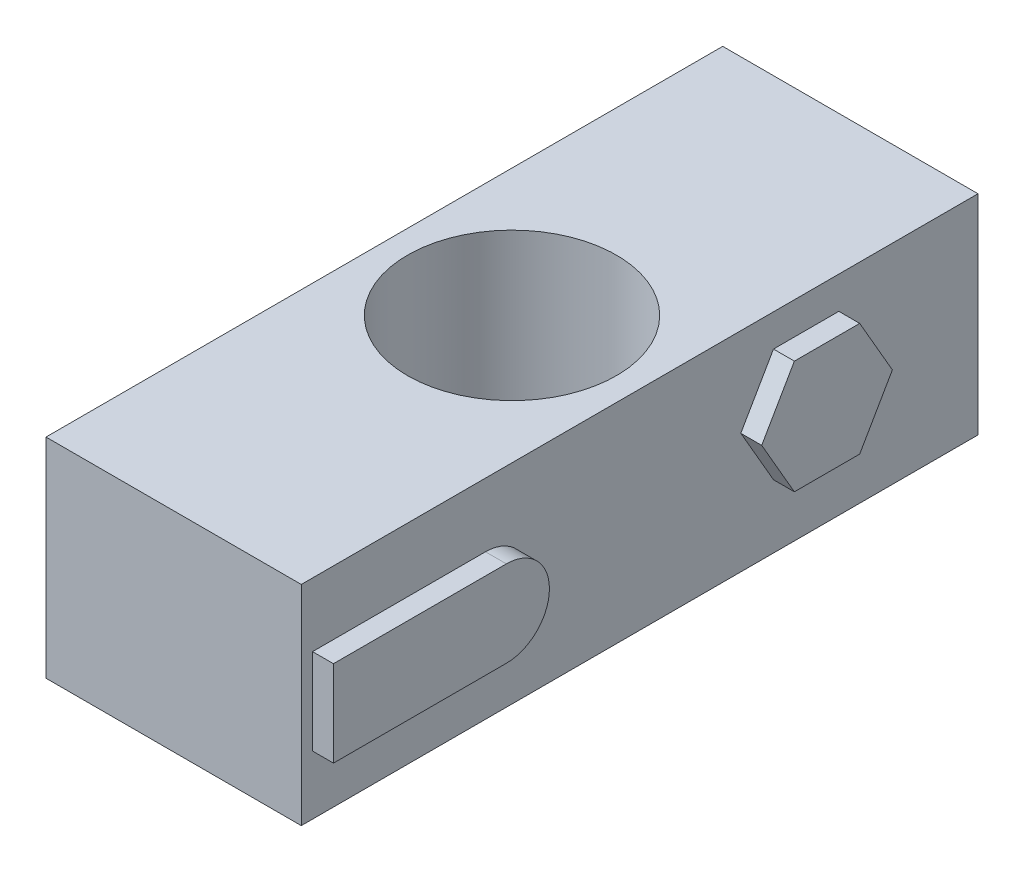
ISO-10303-21;
HEADER;
FILE_DESCRIPTION(('STEP AP214'),'2;1');
FILE_NAME('part.step','',(''),(''),'','','');
FILE_SCHEMA(('AUTOMOTIVE_DESIGN { 1 0 10303 214 1 1 1 1 }'));
ENDSEC;
DATA;
#1=APPLICATION_CONTEXT('core data for automotive mechanical design processes');
#2=APPLICATION_PROTOCOL_DEFINITION('international standard','automotive_design',2000,#1);
#3=PRODUCT_CONTEXT('',#1,'mechanical');
#4=PRODUCT('Part','Part','',(#3));
#5=PRODUCT_RELATED_PRODUCT_CATEGORY('part','',(#4));
#6=PRODUCT_DEFINITION_FORMATION('','',#4);
#7=PRODUCT_DEFINITION_CONTEXT('part definition',#1,'design');
#8=PRODUCT_DEFINITION('design','',#6,#7);
#9=PRODUCT_DEFINITION_SHAPE('','',#8);
#10=(LENGTH_UNIT() NAMED_UNIT(*) SI_UNIT(.MILLI.,.METRE.));
#11=(NAMED_UNIT(*) PLANE_ANGLE_UNIT() SI_UNIT($,.RADIAN.));
#12=(NAMED_UNIT(*) SI_UNIT($,.STERADIAN.) SOLID_ANGLE_UNIT());
#13=UNCERTAINTY_MEASURE_WITH_UNIT(LENGTH_MEASURE(1.E-05),#10,'distance_accuracy_value','');
#14=(GEOMETRIC_REPRESENTATION_CONTEXT(3) GLOBAL_UNCERTAINTY_ASSIGNED_CONTEXT((#13)) GLOBAL_UNIT_ASSIGNED_CONTEXT((#10,
#11,#12)) REPRESENTATION_CONTEXT('',''));
#15=CARTESIAN_POINT('',(0.,0.,0.));
#16=DIRECTION('',(0.,0.,1.));
#17=DIRECTION('',(1.,0.,0.));
#18=AXIS2_PLACEMENT_3D('',#15,#16,#17);
#19=CARTESIAN_POINT('',(-21910.8606227644,-1.55686028497572E-11,32393.));
#20=DIRECTION('',(1.,0.,0.));
#21=DIRECTION('',(0.,1.,0.));
#22=AXIS2_PLACEMENT_3D('',#19,#20,#21);
#23=PLANE('',#22);
#24=DIRECTION('',(0.,-1.,0.));
#25=VECTOR('',#24,1.);
#26=CARTESIAN_POINT('',(-21910.8606227644,-1.55686028497572E-11,0.));
#27=LINE('',#26,#25);
#28=CARTESIAN_POINT('',(-21910.8606227644,16297.1286278851,0.));
#29=VERTEX_POINT('',#28);
#30=CARTESIAN_POINT('',(-21910.8606227644,6297.12862788511,0.));
#31=VERTEX_POINT('',#30);
#32=EDGE_CURVE('E198',#29,#31,#27,.T.);
#33=ORIENTED_EDGE('',*,*,#32,.F.);
#34=DIRECTION('',(0.,0.,-1.));
#35=VECTOR('',#34,1.);
#36=CARTESIAN_POINT('',(-21910.8606227644,16297.1286278851,32393.));
#37=LINE('',#36,#35);
#38=CARTESIAN_POINT('',(-21910.8606227644,16297.1286278851,32393.));
#39=VERTEX_POINT('',#38);
#40=EDGE_CURVE('E11',#39,#29,#37,.T.);
#41=ORIENTED_EDGE('',*,*,#40,.F.);
#42=DIRECTION('',(0.,-1.,0.));
#43=VECTOR('',#42,1.);
#44=CARTESIAN_POINT('',(-21910.8606227644,-1.55686028497572E-11,32393.));
#45=LINE('',#44,#43);
#46=CARTESIAN_POINT('',(-21910.8606227644,6297.12862788511,32393.));
#47=VERTEX_POINT('',#46);
#48=EDGE_CURVE('E201',#39,#47,#45,.T.);
#49=ORIENTED_EDGE('',*,*,#48,.T.);
#50=DIRECTION('',(0.,0.,-1.));
#51=VECTOR('',#50,1.);
#52=CARTESIAN_POINT('',(-21910.8606227644,6297.12862788511,32393.));
#53=LINE('',#52,#51);
#54=EDGE_CURVE('E212',#47,#31,#53,.T.);
#55=ORIENTED_EDGE('',*,*,#54,.T.);
#56=EDGE_LOOP('',(#33,#41,#49,#55));
#57=FACE_BOUND('',#56,.T.);
#58=CARTESIAN_POINT('',(-21910.8606227644,11180.784555409,23576.0383113459));
#59=DIRECTION('',(1.,0.,0.));
#60=DIRECTION('',(0.,1.,0.));
#61=AXIS2_PLACEMENT_3D('',#58,#59,#60);
#62=CIRCLE('',#61,2060.95214100652);
#63=CARTESIAN_POINT('',(-21910.8606227644,13241.7366964155,23576.0383113459));
#64=VERTEX_POINT('',#63);
#65=CARTESIAN_POINT('',(-21910.8606227644,9119.83241440246,23576.0383113459));
#66=VERTEX_POINT('',#65);
#67=EDGE_CURVE('E164',#64,#66,#62,.F.);
#68=ORIENTED_EDGE('',*,*,#67,.T.);
#69=DIRECTION('',(0.,0.,-1.));
#70=VECTOR('',#69,1.);
#71=CARTESIAN_POINT('',(-21910.8606227644,9119.83241440246,0.));
#72=LINE('',#71,#70);
#73=CARTESIAN_POINT('',(-21910.8606227644,9119.83241440246,31853.0880389367));
#74=VERTEX_POINT('',#73);
#75=EDGE_CURVE('E161',#74,#66,#72,.T.);
#76=ORIENTED_EDGE('',*,*,#75,.F.);
#77=DIRECTION('',(0.,-1.,0.));
#78=VECTOR('',#77,1.);
#79=CARTESIAN_POINT('',(-21910.8606227644,-1.47601819267514E-11,31853.0880389367));
#80=LINE('',#79,#78);
#81=CARTESIAN_POINT('',(-21910.8606227644,13241.7366964155,31853.0880389367));
#82=VERTEX_POINT('',#81);
#83=EDGE_CURVE('E173',#82,#74,#80,.T.);
#84=ORIENTED_EDGE('',*,*,#83,.F.);
#85=DIRECTION('',(0.,0.,-1.));
#86=VECTOR('',#85,1.);
#87=CARTESIAN_POINT('',(-21910.8606227644,13241.7366964155,0.));
#88=LINE('',#87,#86);
#89=EDGE_CURVE('E59',#82,#64,#88,.T.);
#90=ORIENTED_EDGE('',*,*,#89,.T.);
#91=EDGE_LOOP('',(#68,#76,#84,#90));
#92=FACE_BOUND('',#91,.T.);
#93=DIRECTION('',(0.,0.866025403784438,0.500000000000001));
#94=VECTOR('',#93,1.);
#95=CARTESIAN_POINT('',(-21910.8606227644,12044.1646392859,5098.60831102538));
#96=LINE('',#95,#94);
#97=CARTESIAN_POINT('',(-21910.8606227644,12044.1646392859,5098.60831102538));
#98=VERTEX_POINT('',#97);
#99=CARTESIAN_POINT('',(-21910.8606227644,14752.7524819604,6662.41223111724));
#100=VERTEX_POINT('',#99);
#101=EDGE_CURVE('E431',#98,#100,#96,.T.);
#102=ORIENTED_EDGE('',*,*,#101,.F.);
#103=DIRECTION('',(0.,0.866025403784441,-0.499999999999995));
#104=VECTOR('',#103,1.);
#105=CARTESIAN_POINT('',(-21910.8606227644,9335.57679661142,6662.41223111721));
#106=LINE('',#105,#104);
#107=CARTESIAN_POINT('',(-21910.8606227644,9335.57679661142,6662.41223111721));
#108=VERTEX_POINT('',#107);
#109=EDGE_CURVE('E159',#108,#98,#106,.T.);
#110=ORIENTED_EDGE('',*,*,#109,.F.);
#111=DIRECTION('',(0.,0.,-1.));
#112=VECTOR('',#111,1.);
#113=CARTESIAN_POINT('',(-21910.8606227644,9335.57679661139,9790.02007130093));
#114=LINE('',#113,#112);
#115=CARTESIAN_POINT('',(-21910.8606227644,9335.57679661139,9790.02007130093));
#116=VERTEX_POINT('',#115);
#117=EDGE_CURVE('E155',#116,#108,#114,.T.);
#118=ORIENTED_EDGE('',*,*,#117,.F.);
#119=DIRECTION('',(0.,-0.866025403784435,-0.500000000000007));
#120=VECTOR('',#119,1.);
#121=CARTESIAN_POINT('',(-21910.8606227644,12044.1646392859,11353.8239913928));
#122=LINE('',#121,#120);
#123=CARTESIAN_POINT('',(-21910.8606227644,12044.1646392859,11353.8239913928));
#124=VERTEX_POINT('',#123);
#125=EDGE_CURVE('E427',#124,#116,#122,.T.);
#126=ORIENTED_EDGE('',*,*,#125,.F.);
#127=DIRECTION('',(0.,-0.866025403784441,0.499999999999995));
#128=VECTOR('',#127,1.);
#129=CARTESIAN_POINT('',(-21910.8606227644,14752.7524819603,9790.02007130096));
#130=LINE('',#129,#128);
#131=CARTESIAN_POINT('',(-21910.8606227644,14752.7524819603,9790.02007130096));
#132=VERTEX_POINT('',#131);
#133=EDGE_CURVE('E439',#132,#124,#130,.T.);
#134=ORIENTED_EDGE('',*,*,#133,.F.);
#135=DIRECTION('',(0.,0.,1.));
#136=VECTOR('',#135,1.);
#137=CARTESIAN_POINT('',(-21910.8606227644,14752.7524819604,6662.41223111724));
#138=LINE('',#137,#136);
#139=EDGE_CURVE('E433',#100,#132,#138,.T.);
#140=ORIENTED_EDGE('',*,*,#139,.F.);
#141=EDGE_LOOP('',(#102,#110,#118,#126,#134,#140));
#142=FACE_BOUND('',#141,.T.);
#143=ADVANCED_FACE('F37',(#57,#92,#142),#23,.T.);
#144=CARTESIAN_POINT('',(0.,16297.1286278851,32393.));
#145=DIRECTION('',(0.,1.,0.));
#146=DIRECTION('',(0.,0.,1.));
#147=AXIS2_PLACEMENT_3D('',#144,#145,#146);
#148=PLANE('',#147);
#149=CARTESIAN_POINT('',(-28020.8606227644,16297.1286278851,16196.5));
#150=DIRECTION('',(0.,1.,0.));
#151=DIRECTION('',(0.,0.,1.));
#152=AXIS2_PLACEMENT_3D('',#149,#150,#151);
#153=CIRCLE('',#152,5000.);
#154=CARTESIAN_POINT('',(-28020.8606227644,16297.1286278851,21196.5));
#155=VERTEX_POINT('',#154);
#156=EDGE_CURVE('E194',#155,#155,#153,.T.);
#157=ORIENTED_EDGE('',*,*,#156,.F.);
#158=EDGE_LOOP('',(#157));
#159=FACE_BOUND('',#158,.T.);
#160=DIRECTION('',(1.,0.,0.));
#161=VECTOR('',#160,1.);
#162=CARTESIAN_POINT('',(0.,16297.1286278851,0.));
#163=LINE('',#162,#161);
#164=CARTESIAN_POINT('',(-34130.8606227644,16297.1286278851,0.));
#165=VERTEX_POINT('',#164);
#166=EDGE_CURVE('E215',#165,#29,#163,.T.);
#167=ORIENTED_EDGE('',*,*,#166,.F.);
#168=DIRECTION('',(0.,0.,-1.));
#169=VECTOR('',#168,1.);
#170=CARTESIAN_POINT('',(-34130.8606227644,16297.1286278851,32393.));
#171=LINE('',#170,#169);
#172=CARTESIAN_POINT('',(-34130.8606227644,16297.1286278851,32393.));
#173=VERTEX_POINT('',#172);
#174=EDGE_CURVE('E44',#173,#165,#171,.T.);
#175=ORIENTED_EDGE('',*,*,#174,.F.);
#176=DIRECTION('',(1.,0.,0.));
#177=VECTOR('',#176,1.);
#178=CARTESIAN_POINT('',(0.,16297.1286278851,32393.));
#179=LINE('',#178,#177);
#180=EDGE_CURVE('E204',#173,#39,#179,.T.);
#181=ORIENTED_EDGE('',*,*,#180,.T.);
#182=ORIENTED_EDGE('',*,*,#40,.T.);
#183=EDGE_LOOP('',(#167,#175,#181,#182));
#184=FACE_BOUND('',#183,.T.);
#185=ADVANCED_FACE('F236',(#159,#184),#148,.T.);
#186=CARTESIAN_POINT('',(-34130.8606227644,0.,32393.));
#187=DIRECTION('',(1.,0.,0.));
#188=DIRECTION('',(0.,0.,-1.));
#189=AXIS2_PLACEMENT_3D('',#186,#187,#188);
#190=PLANE('',#189);
#191=DIRECTION('',(0.,-1.,0.));
#192=VECTOR('',#191,1.);
#193=CARTESIAN_POINT('',(-34130.8606227644,0.,0.));
#194=LINE('',#193,#192);
#195=CARTESIAN_POINT('',(-34130.8606227644,6297.12862788511,0.));
#196=VERTEX_POINT('',#195);
#197=EDGE_CURVE('E218',#165,#196,#194,.T.);
#198=ORIENTED_EDGE('',*,*,#197,.T.);
#199=DIRECTION('',(0.,0.,-1.));
#200=VECTOR('',#199,1.);
#201=CARTESIAN_POINT('',(-34130.8606227644,6297.12862788511,32393.));
#202=LINE('',#201,#200);
#203=CARTESIAN_POINT('',(-34130.8606227644,6297.12862788511,32393.));
#204=VERTEX_POINT('',#203);
#205=EDGE_CURVE('E223',#204,#196,#202,.T.);
#206=ORIENTED_EDGE('',*,*,#205,.F.);
#207=DIRECTION('',(0.,-1.,0.));
#208=VECTOR('',#207,1.);
#209=CARTESIAN_POINT('',(-34130.8606227644,0.,32393.));
#210=LINE('',#209,#208);
#211=EDGE_CURVE('E208',#173,#204,#210,.T.);
#212=ORIENTED_EDGE('',*,*,#211,.F.);
#213=ORIENTED_EDGE('',*,*,#174,.T.);
#214=EDGE_LOOP('',(#198,#206,#212,#213));
#215=FACE_BOUND('',#214,.T.);
#216=ADVANCED_FACE('F228',(#215),#190,.F.);
#217=CARTESIAN_POINT('',(0.,6297.12862788511,32393.));
#218=DIRECTION('',(0.,1.,0.));
#219=DIRECTION('',(0.,0.,1.));
#220=AXIS2_PLACEMENT_3D('',#217,#218,#219);
#221=PLANE('',#220);
#222=CARTESIAN_POINT('',(-28020.8606227644,6297.12862788511,16196.5));
#223=DIRECTION('',(0.,1.,0.));
#224=DIRECTION('',(0.,0.,1.));
#225=AXIS2_PLACEMENT_3D('',#222,#223,#224);
#226=CIRCLE('',#225,5000.);
#227=CARTESIAN_POINT('',(-28020.8606227644,6297.12862788511,21196.5));
#228=VERTEX_POINT('',#227);
#229=EDGE_CURVE('E195',#228,#228,#226,.T.);
#230=ORIENTED_EDGE('',*,*,#229,.T.);
#231=EDGE_LOOP('',(#230));
#232=FACE_BOUND('',#231,.T.);
#233=DIRECTION('',(1.,0.,0.));
#234=VECTOR('',#233,1.);
#235=CARTESIAN_POINT('',(0.,6297.12862788511,0.));
#236=LINE('',#235,#234);
#237=EDGE_CURVE('E205',#196,#31,#236,.T.);
#238=ORIENTED_EDGE('',*,*,#237,.T.);
#239=ORIENTED_EDGE('',*,*,#54,.F.);
#240=DIRECTION('',(1.,0.,0.));
#241=VECTOR('',#240,1.);
#242=CARTESIAN_POINT('',(0.,6297.12862788511,32393.));
#243=LINE('',#242,#241);
#244=EDGE_CURVE('E210',#204,#47,#243,.T.);
#245=ORIENTED_EDGE('',*,*,#244,.F.);
#246=ORIENTED_EDGE('',*,*,#205,.T.);
#247=EDGE_LOOP('',(#238,#239,#245,#246));
#248=FACE_BOUND('',#247,.T.);
#249=ADVANCED_FACE('F244',(#232,#248),#221,.F.);
#250=CARTESIAN_POINT('',(0.,0.,32393.));
#251=DIRECTION('',(0.,0.,1.));
#252=DIRECTION('',(1.,0.,0.));
#253=AXIS2_PLACEMENT_3D('',#250,#251,#252);
#254=PLANE('',#253);
#255=ORIENTED_EDGE('',*,*,#48,.F.);
#256=ORIENTED_EDGE('',*,*,#180,.F.);
#257=ORIENTED_EDGE('',*,*,#211,.T.);
#258=ORIENTED_EDGE('',*,*,#244,.T.);
#259=EDGE_LOOP('',(#255,#256,#257,#258));
#260=FACE_BOUND('',#259,.T.);
#261=ADVANCED_FACE('F246',(#260),#254,.T.);
#262=CARTESIAN_POINT('',(0.,0.,0.));
#263=DIRECTION('',(0.,0.,1.));
#264=DIRECTION('',(1.,0.,0.));
#265=AXIS2_PLACEMENT_3D('',#262,#263,#264);
#266=PLANE('',#265);
#267=ORIENTED_EDGE('',*,*,#32,.T.);
#268=ORIENTED_EDGE('',*,*,#237,.F.);
#269=ORIENTED_EDGE('',*,*,#197,.F.);
#270=ORIENTED_EDGE('',*,*,#166,.T.);
#271=EDGE_LOOP('',(#267,#268,#269,#270));
#272=FACE_BOUND('',#271,.T.);
#273=ADVANCED_FACE('F235',(#272),#266,.F.);
#274=CARTESIAN_POINT('',(-28020.8606227644,6297.12862788511,16196.5));
#275=DIRECTION('',(0.,1.,0.));
#276=DIRECTION('',(0.,0.,1.));
#277=AXIS2_PLACEMENT_3D('',#274,#275,#276);
#278=CYLINDRICAL_SURFACE('',#277,5000.);
#279=ORIENTED_EDGE('',*,*,#229,.F.);
#280=EDGE_LOOP('',(#279));
#281=FACE_BOUND('',#280,.T.);
#282=ORIENTED_EDGE('',*,*,#156,.T.);
#283=EDGE_LOOP('',(#282));
#284=FACE_BOUND('',#283,.T.);
#285=ADVANCED_FACE('F253',(#281,#284),#278,.F.);
#286=CARTESIAN_POINT('',(-20910.8606227644,9119.83241440246,0.));
#287=DIRECTION('',(0.,1.,0.));
#288=DIRECTION('',(-1.,0.,0.));
#289=AXIS2_PLACEMENT_3D('',#286,#287,#288);
#290=PLANE('',#289);
#291=ORIENTED_EDGE('',*,*,#75,.T.);
#292=DIRECTION('',(-1.,0.,0.));
#293=VECTOR('',#292,1.);
#294=CARTESIAN_POINT('',(-20910.8606227644,9119.83241440246,23576.0383113459));
#295=LINE('',#294,#293);
#296=CARTESIAN_POINT('',(-20910.8606227644,9119.83241440246,23576.0383113459));
#297=VERTEX_POINT('',#296);
#298=EDGE_CURVE('E192',#297,#66,#295,.T.);
#299=ORIENTED_EDGE('',*,*,#298,.F.);
#300=DIRECTION('',(0.,0.,-1.));
#301=VECTOR('',#300,1.);
#302=CARTESIAN_POINT('',(-20910.8606227644,9119.83241440246,0.));
#303=LINE('',#302,#301);
#304=CARTESIAN_POINT('',(-20910.8606227644,9119.83241440246,31853.0880389367));
#305=VERTEX_POINT('',#304);
#306=EDGE_CURVE('E170',#305,#297,#303,.T.);
#307=ORIENTED_EDGE('',*,*,#306,.F.);
#308=DIRECTION('',(-1.,0.,0.));
#309=VECTOR('',#308,1.);
#310=CARTESIAN_POINT('',(-20910.8606227644,9119.83241440246,31853.0880389367));
#311=LINE('',#310,#309);
#312=EDGE_CURVE('E180',#305,#74,#311,.T.);
#313=ORIENTED_EDGE('',*,*,#312,.T.);
#314=EDGE_LOOP('',(#291,#299,#307,#313));
#315=FACE_BOUND('',#314,.T.);
#316=ADVANCED_FACE('F272',(#315),#290,.F.);
#317=CARTESIAN_POINT('',(-20910.8606227644,11180.784555409,23576.0383113459));
#318=DIRECTION('',(-1.,0.,0.));
#319=DIRECTION('',(0.,-1.,0.));
#320=AXIS2_PLACEMENT_3D('',#317,#318,#319);
#321=CYLINDRICAL_SURFACE('',#320,2060.95214100652);
#322=ORIENTED_EDGE('',*,*,#67,.F.);
#323=DIRECTION('',(-1.,0.,0.));
#324=VECTOR('',#323,1.);
#325=CARTESIAN_POINT('',(-20910.8606227644,13241.7366964155,23576.0383113459));
#326=LINE('',#325,#324);
#327=CARTESIAN_POINT('',(-20910.8606227644,13241.7366964155,23576.0383113459));
#328=VERTEX_POINT('',#327);
#329=EDGE_CURVE('E190',#328,#64,#326,.T.);
#330=ORIENTED_EDGE('',*,*,#329,.F.);
#331=CARTESIAN_POINT('',(-20910.8606227644,11180.784555409,23576.0383113459));
#332=DIRECTION('',(1.,0.,0.));
#333=DIRECTION('',(0.,1.,0.));
#334=AXIS2_PLACEMENT_3D('',#331,#332,#333);
#335=CIRCLE('',#334,2060.95214100652);
#336=EDGE_CURVE('E172',#328,#297,#335,.F.);
#337=ORIENTED_EDGE('',*,*,#336,.T.);
#338=ORIENTED_EDGE('',*,*,#298,.T.);
#339=EDGE_LOOP('',(#322,#330,#337,#338));
#340=FACE_BOUND('',#339,.T.);
#341=ADVANCED_FACE('F277',(#340),#321,.T.);
#342=CARTESIAN_POINT('',(-20910.8606227644,13241.7366964155,0.));
#343=DIRECTION('',(0.,1.,0.));
#344=DIRECTION('',(-1.,0.,0.));
#345=AXIS2_PLACEMENT_3D('',#342,#343,#344);
#346=PLANE('',#345);
#347=ORIENTED_EDGE('',*,*,#89,.F.);
#348=DIRECTION('',(-1.,0.,0.));
#349=VECTOR('',#348,1.);
#350=CARTESIAN_POINT('',(-20910.8606227644,13241.7366964155,31853.0880389367));
#351=LINE('',#350,#349);
#352=CARTESIAN_POINT('',(-20910.8606227644,13241.7366964155,31853.0880389367));
#353=VERTEX_POINT('',#352);
#354=EDGE_CURVE('E188',#353,#82,#351,.T.);
#355=ORIENTED_EDGE('',*,*,#354,.F.);
#356=DIRECTION('',(0.,0.,-1.));
#357=VECTOR('',#356,1.);
#358=CARTESIAN_POINT('',(-20910.8606227644,13241.7366964155,0.));
#359=LINE('',#358,#357);
#360=EDGE_CURVE('E176',#353,#328,#359,.T.);
#361=ORIENTED_EDGE('',*,*,#360,.T.);
#362=ORIENTED_EDGE('',*,*,#329,.T.);
#363=EDGE_LOOP('',(#347,#355,#361,#362));
#364=FACE_BOUND('',#363,.T.);
#365=ADVANCED_FACE('F284',(#364),#346,.T.);
#366=CARTESIAN_POINT('',(-20910.8606227644,-1.40496391909913E-11,31853.0880389367));
#367=DIRECTION('',(0.,0.,-1.));
#368=DIRECTION('',(-1.,0.,0.));
#369=AXIS2_PLACEMENT_3D('',#366,#367,#368);
#370=PLANE('',#369);
#371=ORIENTED_EDGE('',*,*,#83,.T.);
#372=ORIENTED_EDGE('',*,*,#312,.F.);
#373=DIRECTION('',(0.,-1.,0.));
#374=VECTOR('',#373,1.);
#375=CARTESIAN_POINT('',(-20910.8606227644,-1.40496391909913E-11,31853.0880389367));
#376=LINE('',#375,#374);
#377=EDGE_CURVE('E179',#353,#305,#376,.T.);
#378=ORIENTED_EDGE('',*,*,#377,.F.);
#379=ORIENTED_EDGE('',*,*,#354,.T.);
#380=EDGE_LOOP('',(#371,#372,#378,#379));
#381=FACE_BOUND('',#380,.T.);
#382=ADVANCED_FACE('F288',(#381),#370,.F.);
#383=CARTESIAN_POINT('',(-20910.8606227644,-1.40496391909913E-11,0.));
#384=DIRECTION('',(1.,0.,0.));
#385=DIRECTION('',(0.,1.,0.));
#386=AXIS2_PLACEMENT_3D('',#383,#384,#385);
#387=PLANE('',#386);
#388=ORIENTED_EDGE('',*,*,#306,.T.);
#389=ORIENTED_EDGE('',*,*,#336,.F.);
#390=ORIENTED_EDGE('',*,*,#360,.F.);
#391=ORIENTED_EDGE('',*,*,#377,.T.);
#392=EDGE_LOOP('',(#388,#389,#390,#391));
#393=FACE_BOUND('',#392,.T.);
#394=ADVANCED_FACE('F291',(#393),#387,.T.);
#395=CARTESIAN_POINT('',(-20910.8606227644,9335.57679661142,6662.41223111721));
#396=DIRECTION('',(0.,0.499999999999995,0.866025403784442));
#397=DIRECTION('',(0.,-0.866025403784441,0.499999999999995));
#398=AXIS2_PLACEMENT_3D('',#395,#396,#397);
#399=PLANE('',#398);
#400=ORIENTED_EDGE('',*,*,#109,.T.);
#401=DIRECTION('',(-1.,0.,0.));
#402=VECTOR('',#401,1.);
#403=CARTESIAN_POINT('',(-20910.8606227644,12044.1646392859,5098.60831102538));
#404=LINE('',#403,#402);
#405=CARTESIAN_POINT('',(-20910.8606227644,12044.1646392859,5098.60831102538));
#406=VERTEX_POINT('',#405);
#407=EDGE_CURVE('E140',#406,#98,#404,.T.);
#408=ORIENTED_EDGE('',*,*,#407,.F.);
#409=DIRECTION('',(0.,0.866025403784441,-0.499999999999995));
#410=VECTOR('',#409,1.);
#411=CARTESIAN_POINT('',(-20910.8606227644,9335.57679661142,6662.41223111721));
#412=LINE('',#411,#410);
#413=CARTESIAN_POINT('',(-20910.8606227644,9335.57679661142,6662.41223111721));
#414=VERTEX_POINT('',#413);
#415=EDGE_CURVE('E147',#414,#406,#412,.T.);
#416=ORIENTED_EDGE('',*,*,#415,.F.);
#417=DIRECTION('',(-1.,0.,0.));
#418=VECTOR('',#417,1.);
#419=CARTESIAN_POINT('',(-20910.8606227644,9335.57679661142,6662.41223111721));
#420=LINE('',#419,#418);
#421=EDGE_CURVE('E424',#414,#108,#420,.T.);
#422=ORIENTED_EDGE('',*,*,#421,.T.);
#423=EDGE_LOOP('',(#400,#408,#416,#422));
#424=FACE_BOUND('',#423,.T.);
#425=ADVANCED_FACE('F157',(#424),#399,.F.);
#426=CARTESIAN_POINT('',(-20910.8606227644,12044.1646392859,5098.60831102538));
#427=DIRECTION('',(0.,-0.500000000000001,0.866025403784438));
#428=DIRECTION('',(0.,-0.866025403784438,-0.500000000000001));
#429=AXIS2_PLACEMENT_3D('',#426,#427,#428);
#430=PLANE('',#429);
#431=ORIENTED_EDGE('',*,*,#101,.T.);
#432=DIRECTION('',(-1.,0.,0.));
#433=VECTOR('',#432,1.);
#434=CARTESIAN_POINT('',(-20910.8606227644,14752.7524819604,6662.41223111724));
#435=LINE('',#434,#433);
#436=CARTESIAN_POINT('',(-20910.8606227644,14752.7524819604,6662.41223111724));
#437=VERTEX_POINT('',#436);
#438=EDGE_CURVE('E143',#437,#100,#435,.T.);
#439=ORIENTED_EDGE('',*,*,#438,.F.);
#440=DIRECTION('',(0.,0.866025403784438,0.500000000000001));
#441=VECTOR('',#440,1.);
#442=CARTESIAN_POINT('',(-20910.8606227644,12044.1646392859,5098.60831102538));
#443=LINE('',#442,#441);
#444=EDGE_CURVE('E136',#406,#437,#443,.T.);
#445=ORIENTED_EDGE('',*,*,#444,.F.);
#446=ORIENTED_EDGE('',*,*,#407,.T.);
#447=EDGE_LOOP('',(#431,#439,#445,#446));
#448=FACE_BOUND('',#447,.T.);
#449=ADVANCED_FACE('F138',(#448),#430,.F.);
#450=CARTESIAN_POINT('',(-20910.8606227644,14752.7524819604,6662.41223111724));
#451=DIRECTION('',(0.,-1.,0.));
#452=DIRECTION('',(0.,0.,-1.));
#453=AXIS2_PLACEMENT_3D('',#450,#451,#452);
#454=PLANE('',#453);
#455=ORIENTED_EDGE('',*,*,#139,.T.);
#456=DIRECTION('',(-1.,0.,0.));
#457=VECTOR('',#456,1.);
#458=CARTESIAN_POINT('',(-20910.8606227644,14752.7524819603,9790.02007130096));
#459=LINE('',#458,#457);
#460=CARTESIAN_POINT('',(-20910.8606227644,14752.7524819603,9790.02007130096));
#461=VERTEX_POINT('',#460);
#462=EDGE_CURVE('E166',#461,#132,#459,.T.);
#463=ORIENTED_EDGE('',*,*,#462,.F.);
#464=DIRECTION('',(0.,0.,1.));
#465=VECTOR('',#464,1.);
#466=CARTESIAN_POINT('',(-20910.8606227644,14752.7524819604,6662.41223111724));
#467=LINE('',#466,#465);
#468=EDGE_CURVE('E146',#437,#461,#467,.T.);
#469=ORIENTED_EDGE('',*,*,#468,.F.);
#470=ORIENTED_EDGE('',*,*,#438,.T.);
#471=EDGE_LOOP('',(#455,#463,#469,#470));
#472=FACE_BOUND('',#471,.T.);
#473=ADVANCED_FACE('F300',(#472),#454,.F.);
#474=CARTESIAN_POINT('',(-20910.8606227644,14752.7524819603,9790.02007130096));
#475=DIRECTION('',(0.,-0.499999999999995,-0.866025403784442));
#476=DIRECTION('',(0.,0.866025403784441,-0.499999999999995));
#477=AXIS2_PLACEMENT_3D('',#474,#475,#476);
#478=PLANE('',#477);
#479=ORIENTED_EDGE('',*,*,#133,.T.);
#480=DIRECTION('',(-1.,0.,0.));
#481=VECTOR('',#480,1.);
#482=CARTESIAN_POINT('',(-20910.8606227644,12044.1646392859,11353.8239913928));
#483=LINE('',#482,#481);
#484=CARTESIAN_POINT('',(-20910.8606227644,12044.1646392859,11353.8239913928));
#485=VERTEX_POINT('',#484);
#486=EDGE_CURVE('E443',#485,#124,#483,.T.);
#487=ORIENTED_EDGE('',*,*,#486,.F.);
#488=DIRECTION('',(0.,-0.866025403784441,0.499999999999995));
#489=VECTOR('',#488,1.);
#490=CARTESIAN_POINT('',(-20910.8606227644,14752.7524819603,9790.02007130096));
#491=LINE('',#490,#489);
#492=EDGE_CURVE('E450',#461,#485,#491,.T.);
#493=ORIENTED_EDGE('',*,*,#492,.F.);
#494=ORIENTED_EDGE('',*,*,#462,.T.);
#495=EDGE_LOOP('',(#479,#487,#493,#494));
#496=FACE_BOUND('',#495,.T.);
#497=ADVANCED_FACE('F303',(#496),#478,.F.);
#498=CARTESIAN_POINT('',(-20910.8606227644,12044.1646392859,11353.8239913928));
#499=DIRECTION('',(0.,0.500000000000007,-0.866025403784435));
#500=DIRECTION('',(0.,0.866025403784435,0.500000000000007));
#501=AXIS2_PLACEMENT_3D('',#498,#499,#500);
#502=PLANE('',#501);
#503=ORIENTED_EDGE('',*,*,#125,.T.);
#504=DIRECTION('',(-1.,0.,0.));
#505=VECTOR('',#504,1.);
#506=CARTESIAN_POINT('',(-20910.8606227644,9335.57679661139,9790.02007130093));
#507=LINE('',#506,#505);
#508=CARTESIAN_POINT('',(-20910.8606227644,9335.57679661139,9790.02007130093));
#509=VERTEX_POINT('',#508);
#510=EDGE_CURVE('E51',#509,#116,#507,.T.);
#511=ORIENTED_EDGE('',*,*,#510,.F.);
#512=DIRECTION('',(0.,-0.866025403784435,-0.500000000000007));
#513=VECTOR('',#512,1.);
#514=CARTESIAN_POINT('',(-20910.8606227644,12044.1646392859,11353.8239913928));
#515=LINE('',#514,#513);
#516=EDGE_CURVE('E452',#485,#509,#515,.T.);
#517=ORIENTED_EDGE('',*,*,#516,.F.);
#518=ORIENTED_EDGE('',*,*,#486,.T.);
#519=EDGE_LOOP('',(#503,#511,#517,#518));
#520=FACE_BOUND('',#519,.T.);
#521=ADVANCED_FACE('F307',(#520),#502,.F.);
#522=CARTESIAN_POINT('',(-20910.8606227644,9335.57679661139,9790.02007130093));
#523=DIRECTION('',(0.,1.,0.));
#524=DIRECTION('',(0.,0.,1.));
#525=AXIS2_PLACEMENT_3D('',#522,#523,#524);
#526=PLANE('',#525);
#527=ORIENTED_EDGE('',*,*,#117,.T.);
#528=ORIENTED_EDGE('',*,*,#421,.F.);
#529=DIRECTION('',(0.,0.,-1.));
#530=VECTOR('',#529,1.);
#531=CARTESIAN_POINT('',(-20910.8606227644,9335.57679661139,9790.02007130093));
#532=LINE('',#531,#530);
#533=EDGE_CURVE('E151',#509,#414,#532,.T.);
#534=ORIENTED_EDGE('',*,*,#533,.F.);
#535=ORIENTED_EDGE('',*,*,#510,.T.);
#536=EDGE_LOOP('',(#527,#528,#534,#535));
#537=FACE_BOUND('',#536,.T.);
#538=ADVANCED_FACE('F311',(#537),#526,.F.);
#539=CARTESIAN_POINT('',(-20910.8606227644,-1.36591249232224E-11,-2.48889944732374E-11));
#540=DIRECTION('',(1.,0.,0.));
#541=DIRECTION('',(0.,0.,-1.));
#542=AXIS2_PLACEMENT_3D('',#539,#540,#541);
#543=PLANE('',#542);
#544=ORIENTED_EDGE('',*,*,#415,.T.);
#545=ORIENTED_EDGE('',*,*,#444,.T.);
#546=ORIENTED_EDGE('',*,*,#468,.T.);
#547=ORIENTED_EDGE('',*,*,#492,.T.);
#548=ORIENTED_EDGE('',*,*,#516,.T.);
#549=ORIENTED_EDGE('',*,*,#533,.T.);
#550=EDGE_LOOP('',(#544,#545,#546,#547,#548,#549));
#551=FACE_BOUND('',#550,.T.);
#552=ADVANCED_FACE('F150',(#551),#543,.T.);
#553=CLOSED_SHELL('',(#143,#185,#216,#249,#261,#273,#285,#316,#341,#365,#382,#394,#425,#449,
#473,#497,#521,#538,#552));
#554=MANIFOLD_SOLID_BREP('B2',#553);
#555=ADVANCED_BREP_SHAPE_REPRESENTATION('',(#18,#554),#14);
#556=SHAPE_DEFINITION_REPRESENTATION(#9,#555);
ENDSEC;
END-ISO-10303-21;
